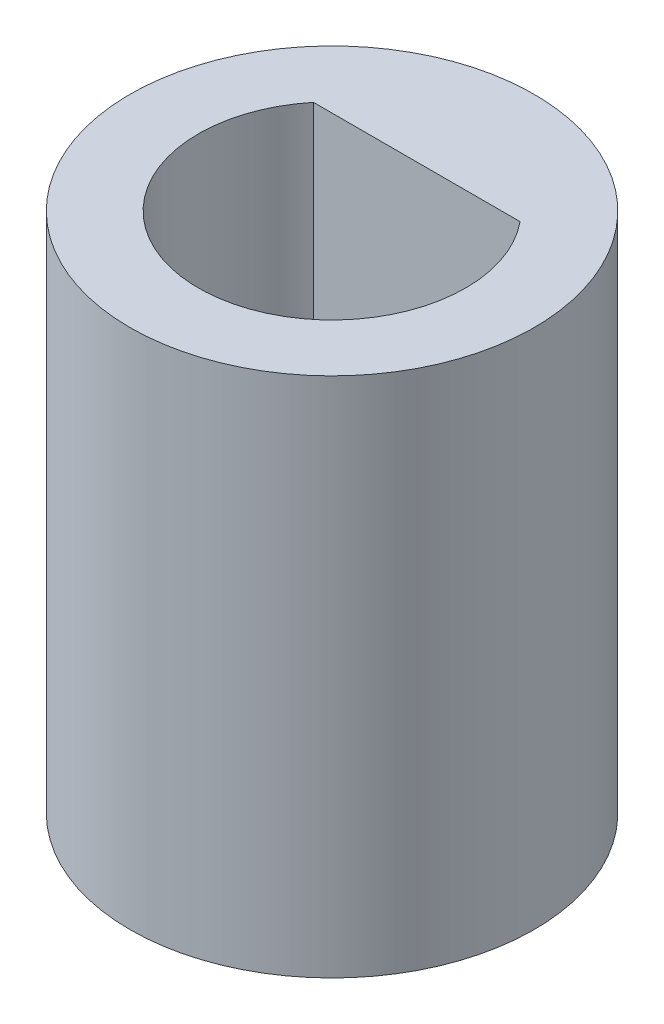
ISO-10303-21;
HEADER;
FILE_DESCRIPTION(('STEP AP214'),'2;1');
FILE_NAME('part.step','',(''),(''),'','','');
FILE_SCHEMA(('AUTOMOTIVE_DESIGN { 1 0 10303 214 1 1 1 1 }'));
ENDSEC;
DATA;
#1=APPLICATION_CONTEXT('core data for automotive mechanical design processes');
#2=APPLICATION_PROTOCOL_DEFINITION('international standard','automotive_design',2000,#1);
#3=PRODUCT_CONTEXT('',#1,'mechanical');
#4=PRODUCT('Part','Part','',(#3));
#5=PRODUCT_RELATED_PRODUCT_CATEGORY('part','',(#4));
#6=PRODUCT_DEFINITION_FORMATION('','',#4);
#7=PRODUCT_DEFINITION_CONTEXT('part definition',#1,'design');
#8=PRODUCT_DEFINITION('design','',#6,#7);
#9=PRODUCT_DEFINITION_SHAPE('','',#8);
#10=(LENGTH_UNIT() NAMED_UNIT(*) SI_UNIT(.MILLI.,.METRE.));
#11=(NAMED_UNIT(*) PLANE_ANGLE_UNIT() SI_UNIT($,.RADIAN.));
#12=(NAMED_UNIT(*) SI_UNIT($,.STERADIAN.) SOLID_ANGLE_UNIT());
#13=UNCERTAINTY_MEASURE_WITH_UNIT(LENGTH_MEASURE(1.E-05),#10,'distance_accuracy_value','');
#14=(GEOMETRIC_REPRESENTATION_CONTEXT(3) GLOBAL_UNCERTAINTY_ASSIGNED_CONTEXT((#13)) GLOBAL_UNIT_ASSIGNED_CONTEXT((#10,
#11,#12)) REPRESENTATION_CONTEXT('',''));
#15=CARTESIAN_POINT('',(0.,0.,0.));
#16=DIRECTION('',(0.,0.,1.));
#17=DIRECTION('',(1.,0.,0.));
#18=AXIS2_PLACEMENT_3D('',#15,#16,#17);
#19=CARTESIAN_POINT('',(0.,8.,0.));
#20=DIRECTION('',(0.,-1.,0.));
#21=DIRECTION('',(0.,0.,-1.));
#22=AXIS2_PLACEMENT_3D('',#19,#20,#21);
#23=CYLINDRICAL_SURFACE('',#22,2.05);
#24=CARTESIAN_POINT('',(0.,0.,0.));
#25=DIRECTION('',(0.,1.,0.));
#26=DIRECTION('',(0.,0.,1.));
#27=AXIS2_PLACEMENT_3D('',#24,#25,#26);
#28=CIRCLE('',#27,2.05);
#29=CARTESIAN_POINT('',(-1.58508674841474,0.,-1.3));
#30=VERTEX_POINT('',#29);
#31=CARTESIAN_POINT('',(1.58508674841474,0.,-1.3));
#32=VERTEX_POINT('',#31);
#33=EDGE_CURVE('E74',#30,#32,#28,.T.);
#34=ORIENTED_EDGE('',*,*,#33,.F.);
#35=DIRECTION('',(0.,-1.,0.));
#36=VECTOR('',#35,1.);
#37=CARTESIAN_POINT('',(-1.58508674841474,8.,-1.3));
#38=LINE('',#37,#36);
#39=CARTESIAN_POINT('',(-1.58508674841474,8.,-1.3));
#40=VERTEX_POINT('',#39);
#41=EDGE_CURVE('E11',#40,#30,#38,.T.);
#42=ORIENTED_EDGE('',*,*,#41,.F.);
#43=CARTESIAN_POINT('',(0.,8.,0.));
#44=DIRECTION('',(0.,1.,0.));
#45=DIRECTION('',(0.,0.,1.));
#46=AXIS2_PLACEMENT_3D('',#43,#44,#45);
#47=CIRCLE('',#46,2.05);
#48=CARTESIAN_POINT('',(1.58508674841474,8.,-1.3));
#49=VERTEX_POINT('',#48);
#50=EDGE_CURVE('E75',#40,#49,#47,.T.);
#51=ORIENTED_EDGE('',*,*,#50,.T.);
#52=DIRECTION('',(0.,-1.,0.));
#53=VECTOR('',#52,1.);
#54=CARTESIAN_POINT('',(1.58508674841474,8.,-1.3));
#55=LINE('',#54,#53);
#56=EDGE_CURVE('E54',#49,#32,#55,.T.);
#57=ORIENTED_EDGE('',*,*,#56,.T.);
#58=EDGE_LOOP('',(#34,#42,#51,#57));
#59=FACE_BOUND('',#58,.T.);
#60=ADVANCED_FACE('F45',(#59),#23,.F.);
#61=CARTESIAN_POINT('',(0.,8.,-1.3));
#62=DIRECTION('',(0.,0.,-1.));
#63=DIRECTION('',(-1.,0.,0.));
#64=AXIS2_PLACEMENT_3D('',#61,#62,#63);
#65=PLANE('',#64);
#66=DIRECTION('',(1.,0.,0.));
#67=VECTOR('',#66,1.);
#68=CARTESIAN_POINT('',(0.,0.,-1.3));
#69=LINE('',#68,#67);
#70=EDGE_CURVE('E78',#30,#32,#69,.T.);
#71=ORIENTED_EDGE('',*,*,#70,.T.);
#72=ORIENTED_EDGE('',*,*,#56,.F.);
#73=DIRECTION('',(1.,0.,0.));
#74=VECTOR('',#73,1.);
#75=CARTESIAN_POINT('',(0.,8.,-1.3));
#76=LINE('',#75,#74);
#77=EDGE_CURVE('E61',#40,#49,#76,.T.);
#78=ORIENTED_EDGE('',*,*,#77,.F.);
#79=ORIENTED_EDGE('',*,*,#41,.T.);
#80=EDGE_LOOP('',(#71,#72,#78,#79));
#81=FACE_BOUND('',#80,.T.);
#82=ADVANCED_FACE('F79',(#81),#65,.F.);
#83=CARTESIAN_POINT('',(0.,8.,0.));
#84=DIRECTION('',(0.,-1.,0.));
#85=DIRECTION('',(0.,0.,-1.));
#86=AXIS2_PLACEMENT_3D('',#83,#84,#85);
#87=CYLINDRICAL_SURFACE('',#86,3.1);
#88=CARTESIAN_POINT('',(0.,8.,0.));
#89=DIRECTION('',(0.,1.,0.));
#90=DIRECTION('',(0.,0.,1.));
#91=AXIS2_PLACEMENT_3D('',#88,#89,#90);
#92=CIRCLE('',#91,3.1);
#93=CARTESIAN_POINT('',(0.,8.,3.1));
#94=VERTEX_POINT('',#93);
#95=EDGE_CURVE('E77',#94,#94,#92,.T.);
#96=ORIENTED_EDGE('',*,*,#95,.F.);
#97=EDGE_LOOP('',(#96));
#98=FACE_BOUND('',#97,.T.);
#99=CARTESIAN_POINT('',(0.,0.,0.));
#100=DIRECTION('',(0.,1.,0.));
#101=DIRECTION('',(0.,0.,1.));
#102=AXIS2_PLACEMENT_3D('',#99,#100,#101);
#103=CIRCLE('',#102,3.1);
#104=CARTESIAN_POINT('',(0.,0.,3.1));
#105=VERTEX_POINT('',#104);
#106=EDGE_CURVE('E82',#105,#105,#103,.T.);
#107=ORIENTED_EDGE('',*,*,#106,.T.);
#108=EDGE_LOOP('',(#107));
#109=FACE_BOUND('',#108,.T.);
#110=ADVANCED_FACE('F104',(#98,#109),#87,.T.);
#111=CARTESIAN_POINT('',(0.,8.,0.));
#112=DIRECTION('',(0.,1.,0.));
#113=DIRECTION('',(0.,0.,1.));
#114=AXIS2_PLACEMENT_3D('',#111,#112,#113);
#115=PLANE('',#114);
#116=ORIENTED_EDGE('',*,*,#50,.F.);
#117=ORIENTED_EDGE('',*,*,#77,.T.);
#118=EDGE_LOOP('',(#116,#117));
#119=FACE_BOUND('',#118,.T.);
#120=ORIENTED_EDGE('',*,*,#95,.T.);
#121=EDGE_LOOP('',(#120));
#122=FACE_BOUND('',#121,.T.);
#123=ADVANCED_FACE('F102',(#119,#122),#115,.T.);
#124=CARTESIAN_POINT('',(0.,0.,0.));
#125=DIRECTION('',(0.,1.,0.));
#126=DIRECTION('',(0.,0.,1.));
#127=AXIS2_PLACEMENT_3D('',#124,#125,#126);
#128=PLANE('',#127);
#129=ORIENTED_EDGE('',*,*,#33,.T.);
#130=ORIENTED_EDGE('',*,*,#70,.F.);
#131=EDGE_LOOP('',(#129,#130));
#132=FACE_BOUND('',#131,.T.);
#133=ORIENTED_EDGE('',*,*,#106,.F.);
#134=EDGE_LOOP('',(#133));
#135=FACE_BOUND('',#134,.T.);
#136=ADVANCED_FACE('F84',(#132,#135),#128,.F.);
#137=CLOSED_SHELL('',(#60,#82,#110,#123,#136));
#138=MANIFOLD_SOLID_BREP('B2',#137);
#139=ADVANCED_BREP_SHAPE_REPRESENTATION('',(#18,#138),#14);
#140=SHAPE_DEFINITION_REPRESENTATION(#9,#139);
ENDSEC;
END-ISO-10303-21;
